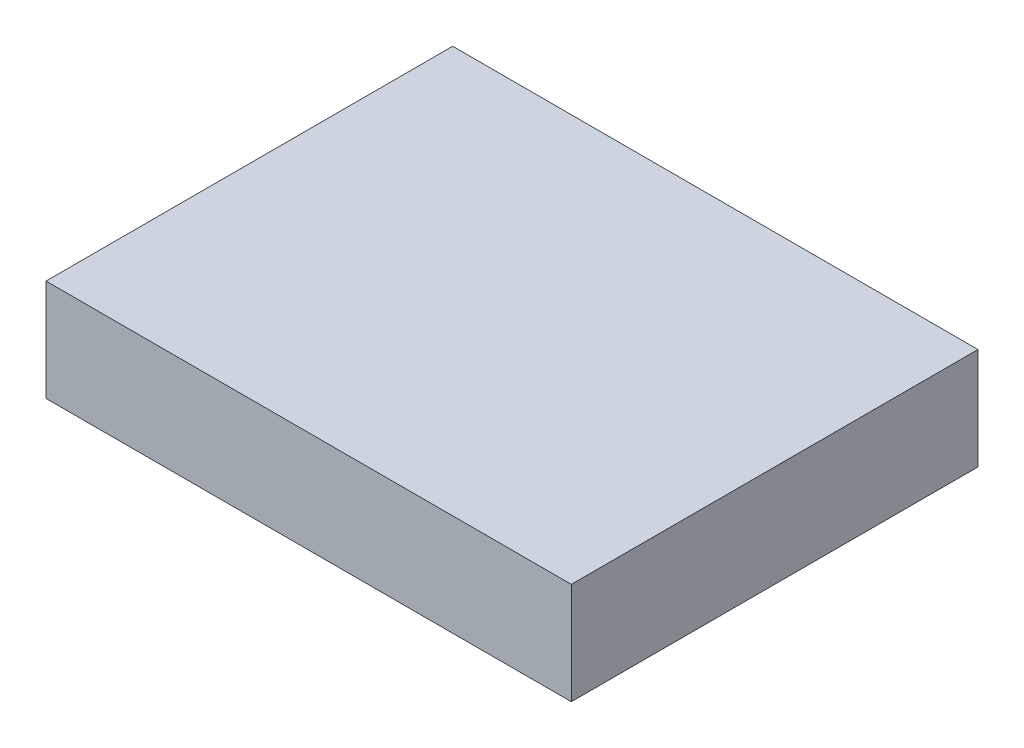
ISO-10303-21;
HEADER;
FILE_DESCRIPTION(('STEP AP214'),'2;1');
FILE_NAME('part.step','',(''),(''),'','','');
FILE_SCHEMA(('AUTOMOTIVE_DESIGN { 1 0 10303 214 1 1 1 1 }'));
ENDSEC;
DATA;
#1=APPLICATION_CONTEXT('core data for automotive mechanical design processes');
#2=APPLICATION_PROTOCOL_DEFINITION('international standard','automotive_design',2000,#1);
#3=PRODUCT_CONTEXT('',#1,'mechanical');
#4=PRODUCT('Part','Part','',(#3));
#5=PRODUCT_RELATED_PRODUCT_CATEGORY('part','',(#4));
#6=PRODUCT_DEFINITION_FORMATION('','',#4);
#7=PRODUCT_DEFINITION_CONTEXT('part definition',#1,'design');
#8=PRODUCT_DEFINITION('design','',#6,#7);
#9=PRODUCT_DEFINITION_SHAPE('','',#8);
#10=(LENGTH_UNIT() NAMED_UNIT(*) SI_UNIT(.MILLI.,.METRE.));
#11=(NAMED_UNIT(*) PLANE_ANGLE_UNIT() SI_UNIT($,.RADIAN.));
#12=(NAMED_UNIT(*) SI_UNIT($,.STERADIAN.) SOLID_ANGLE_UNIT());
#13=UNCERTAINTY_MEASURE_WITH_UNIT(LENGTH_MEASURE(1.E-05),#10,'distance_accuracy_value','');
#14=(GEOMETRIC_REPRESENTATION_CONTEXT(3) GLOBAL_UNCERTAINTY_ASSIGNED_CONTEXT((#13)) GLOBAL_UNIT_ASSIGNED_CONTEXT((#10,
#11,#12)) REPRESENTATION_CONTEXT('',''));
#15=CARTESIAN_POINT('',(0.,0.,0.));
#16=DIRECTION('',(0.,0.,1.));
#17=DIRECTION('',(1.,0.,0.));
#18=AXIS2_PLACEMENT_3D('',#15,#16,#17);
#19=CARTESIAN_POINT('',(-7.75,3.,6.));
#20=DIRECTION('',(1.,0.,0.));
#21=DIRECTION('',(0.,0.,-1.));
#22=AXIS2_PLACEMENT_3D('',#19,#20,#21);
#23=PLANE('',#22);
#24=DIRECTION('',(0.,0.,1.));
#25=VECTOR('',#24,1.);
#26=CARTESIAN_POINT('',(-7.75,0.,6.));
#27=LINE('',#26,#25);
#28=CARTESIAN_POINT('',(-7.75,0.,-6.));
#29=VERTEX_POINT('',#28);
#30=CARTESIAN_POINT('',(-7.75,0.,6.));
#31=VERTEX_POINT('',#30);
#32=EDGE_CURVE('E95',#29,#31,#27,.T.);
#33=ORIENTED_EDGE('',*,*,#32,.T.);
#34=DIRECTION('',(0.,-1.,0.));
#35=VECTOR('',#34,1.);
#36=CARTESIAN_POINT('',(-7.75,3.,6.));
#37=LINE('',#36,#35);
#38=CARTESIAN_POINT('',(-7.75,3.,6.));
#39=VERTEX_POINT('',#38);
#40=EDGE_CURVE('E11',#39,#31,#37,.T.);
#41=ORIENTED_EDGE('',*,*,#40,.F.);
#42=DIRECTION('',(0.,0.,1.));
#43=VECTOR('',#42,1.);
#44=CARTESIAN_POINT('',(-7.75,3.,6.));
#45=LINE('',#44,#43);
#46=CARTESIAN_POINT('',(-7.75,3.,-6.));
#47=VERTEX_POINT('',#46);
#48=EDGE_CURVE('E83',#47,#39,#45,.T.);
#49=ORIENTED_EDGE('',*,*,#48,.F.);
#50=DIRECTION('',(0.,-1.,0.));
#51=VECTOR('',#50,1.);
#52=CARTESIAN_POINT('',(-7.75,3.,-6.));
#53=LINE('',#52,#51);
#54=EDGE_CURVE('E91',#47,#29,#53,.T.);
#55=ORIENTED_EDGE('',*,*,#54,.T.);
#56=EDGE_LOOP('',(#33,#41,#49,#55));
#57=FACE_BOUND('',#56,.T.);
#58=ADVANCED_FACE('F32',(#57),#23,.F.);
#59=CARTESIAN_POINT('',(7.75,3.,6.));
#60=DIRECTION('',(0.,0.,-1.));
#61=DIRECTION('',(-1.,0.,0.));
#62=AXIS2_PLACEMENT_3D('',#59,#60,#61);
#63=PLANE('',#62);
#64=DIRECTION('',(1.,0.,0.));
#65=VECTOR('',#64,1.);
#66=CARTESIAN_POINT('',(7.75,0.,6.));
#67=LINE('',#66,#65);
#68=CARTESIAN_POINT('',(7.75,0.,6.));
#69=VERTEX_POINT('',#68);
#70=EDGE_CURVE('E87',#31,#69,#67,.T.);
#71=ORIENTED_EDGE('',*,*,#70,.T.);
#72=DIRECTION('',(0.,-1.,0.));
#73=VECTOR('',#72,1.);
#74=CARTESIAN_POINT('',(7.75,3.,6.));
#75=LINE('',#74,#73);
#76=CARTESIAN_POINT('',(7.75,3.,6.));
#77=VERTEX_POINT('',#76);
#78=EDGE_CURVE('E40',#77,#69,#75,.T.);
#79=ORIENTED_EDGE('',*,*,#78,.F.);
#80=DIRECTION('',(1.,0.,0.));
#81=VECTOR('',#80,1.);
#82=CARTESIAN_POINT('',(7.75,3.,6.));
#83=LINE('',#82,#81);
#84=EDGE_CURVE('E78',#39,#77,#83,.T.);
#85=ORIENTED_EDGE('',*,*,#84,.F.);
#86=ORIENTED_EDGE('',*,*,#40,.T.);
#87=EDGE_LOOP('',(#71,#79,#85,#86));
#88=FACE_BOUND('',#87,.T.);
#89=ADVANCED_FACE('F86',(#88),#63,.F.);
#90=CARTESIAN_POINT('',(7.75,3.,6.));
#91=DIRECTION('',(-1.,0.,0.));
#92=DIRECTION('',(0.,0.,1.));
#93=AXIS2_PLACEMENT_3D('',#90,#91,#92);
#94=PLANE('',#93);
#95=DIRECTION('',(0.,0.,-1.));
#96=VECTOR('',#95,1.);
#97=CARTESIAN_POINT('',(7.75,0.,6.));
#98=LINE('',#97,#96);
#99=CARTESIAN_POINT('',(7.75,0.,-6.));
#100=VERTEX_POINT('',#99);
#101=EDGE_CURVE('E65',#69,#100,#98,.T.);
#102=ORIENTED_EDGE('',*,*,#101,.T.);
#103=DIRECTION('',(0.,-1.,0.));
#104=VECTOR('',#103,1.);
#105=CARTESIAN_POINT('',(7.75,3.,-6.));
#106=LINE('',#105,#104);
#107=CARTESIAN_POINT('',(7.75,3.,-6.));
#108=VERTEX_POINT('',#107);
#109=EDGE_CURVE('E88',#108,#100,#106,.T.);
#110=ORIENTED_EDGE('',*,*,#109,.F.);
#111=DIRECTION('',(0.,0.,-1.));
#112=VECTOR('',#111,1.);
#113=CARTESIAN_POINT('',(7.75,3.,6.));
#114=LINE('',#113,#112);
#115=EDGE_CURVE('E81',#77,#108,#114,.T.);
#116=ORIENTED_EDGE('',*,*,#115,.F.);
#117=ORIENTED_EDGE('',*,*,#78,.T.);
#118=EDGE_LOOP('',(#102,#110,#116,#117));
#119=FACE_BOUND('',#118,.T.);
#120=ADVANCED_FACE('F89',(#119),#94,.F.);
#121=CARTESIAN_POINT('',(7.75,3.,-6.));
#122=DIRECTION('',(0.,0.,1.));
#123=DIRECTION('',(1.,0.,0.));
#124=AXIS2_PLACEMENT_3D('',#121,#122,#123);
#125=PLANE('',#124);
#126=DIRECTION('',(-1.,0.,0.));
#127=VECTOR('',#126,1.);
#128=CARTESIAN_POINT('',(7.75,0.,-6.));
#129=LINE('',#128,#127);
#130=EDGE_CURVE('E71',#100,#29,#129,.T.);
#131=ORIENTED_EDGE('',*,*,#130,.T.);
#132=ORIENTED_EDGE('',*,*,#54,.F.);
#133=DIRECTION('',(-1.,0.,0.));
#134=VECTOR('',#133,1.);
#135=CARTESIAN_POINT('',(7.75,3.,-6.));
#136=LINE('',#135,#134);
#137=EDGE_CURVE('E48',#108,#47,#136,.T.);
#138=ORIENTED_EDGE('',*,*,#137,.F.);
#139=ORIENTED_EDGE('',*,*,#109,.T.);
#140=EDGE_LOOP('',(#131,#132,#138,#139));
#141=FACE_BOUND('',#140,.T.);
#142=ADVANCED_FACE('F102',(#141),#125,.F.);
#143=CARTESIAN_POINT('',(0.,3.,0.));
#144=DIRECTION('',(0.,1.,0.));
#145=DIRECTION('',(0.,0.,1.));
#146=AXIS2_PLACEMENT_3D('',#143,#144,#145);
#147=PLANE('',#146);
#148=ORIENTED_EDGE('',*,*,#48,.T.);
#149=ORIENTED_EDGE('',*,*,#84,.T.);
#150=ORIENTED_EDGE('',*,*,#115,.T.);
#151=ORIENTED_EDGE('',*,*,#137,.T.);
#152=EDGE_LOOP('',(#148,#149,#150,#151));
#153=FACE_BOUND('',#152,.T.);
#154=ADVANCED_FACE('F79',(#153),#147,.T.);
#155=CARTESIAN_POINT('',(0.,0.,0.));
#156=DIRECTION('',(0.,1.,0.));
#157=DIRECTION('',(0.,0.,1.));
#158=AXIS2_PLACEMENT_3D('',#155,#156,#157);
#159=PLANE('',#158);
#160=ORIENTED_EDGE('',*,*,#32,.F.);
#161=ORIENTED_EDGE('',*,*,#130,.F.);
#162=ORIENTED_EDGE('',*,*,#101,.F.);
#163=ORIENTED_EDGE('',*,*,#70,.F.);
#164=EDGE_LOOP('',(#160,#161,#162,#163));
#165=FACE_BOUND('',#164,.T.);
#166=ADVANCED_FACE('F105',(#165),#159,.F.);
#167=CLOSED_SHELL('',(#58,#89,#120,#142,#154,#166));
#168=MANIFOLD_SOLID_BREP('B2',#167);
#169=ADVANCED_BREP_SHAPE_REPRESENTATION('',(#18,#168),#14);
#170=SHAPE_DEFINITION_REPRESENTATION(#9,#169);
ENDSEC;
END-ISO-10303-21;
